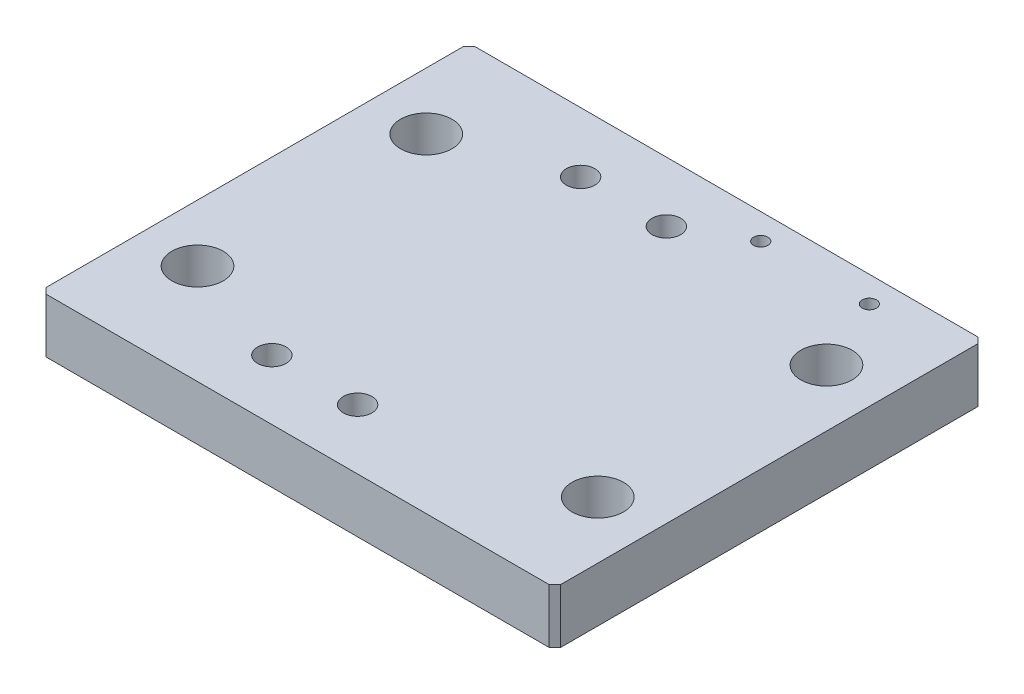
ISO-10303-21;
HEADER;
FILE_DESCRIPTION(('STEP AP214'),'2;1');
FILE_NAME('part.step','',(''),(''),'','','');
FILE_SCHEMA(('AUTOMOTIVE_DESIGN { 1 0 10303 214 1 1 1 1 }'));
ENDSEC;
DATA;
#1=APPLICATION_CONTEXT('core data for automotive mechanical design processes');
#2=APPLICATION_PROTOCOL_DEFINITION('international standard','automotive_design',2000,#1);
#3=PRODUCT_CONTEXT('',#1,'mechanical');
#4=PRODUCT('Part','Part','',(#3));
#5=PRODUCT_RELATED_PRODUCT_CATEGORY('part','',(#4));
#6=PRODUCT_DEFINITION_FORMATION('','',#4);
#7=PRODUCT_DEFINITION_CONTEXT('part definition',#1,'design');
#8=PRODUCT_DEFINITION('design','',#6,#7);
#9=PRODUCT_DEFINITION_SHAPE('','',#8);
#10=(LENGTH_UNIT() NAMED_UNIT(*) SI_UNIT(.MILLI.,.METRE.));
#11=(NAMED_UNIT(*) PLANE_ANGLE_UNIT() SI_UNIT($,.RADIAN.));
#12=(NAMED_UNIT(*) SI_UNIT($,.STERADIAN.) SOLID_ANGLE_UNIT());
#13=UNCERTAINTY_MEASURE_WITH_UNIT(LENGTH_MEASURE(1.E-05),#10,'distance_accuracy_value','');
#14=(GEOMETRIC_REPRESENTATION_CONTEXT(3) GLOBAL_UNCERTAINTY_ASSIGNED_CONTEXT((#13)) GLOBAL_UNIT_ASSIGNED_CONTEXT((#10,
#11,#12)) REPRESENTATION_CONTEXT('',''));
#15=CARTESIAN_POINT('',(0.,0.,0.));
#16=DIRECTION('',(0.,0.,1.));
#17=DIRECTION('',(1.,0.,0.));
#18=AXIS2_PLACEMENT_3D('',#15,#16,#17);
#19=CARTESIAN_POINT('',(45.,9.525,-37.5));
#20=DIRECTION('',(-1.,0.,0.));
#21=DIRECTION('',(0.,0.,1.));
#22=AXIS2_PLACEMENT_3D('',#19,#20,#21);
#23=PLANE('',#22);
#24=DIRECTION('',(0.,0.,-1.));
#25=VECTOR('',#24,1.);
#26=CARTESIAN_POINT('',(45.,9.525,-37.5));
#27=LINE('',#26,#25);
#28=CARTESIAN_POINT('',(45.,9.525,36.5));
#29=VERTEX_POINT('',#28);
#30=CARTESIAN_POINT('',(45.,9.525,-36.5));
#31=VERTEX_POINT('',#30);
#32=EDGE_CURVE('E133',#29,#31,#27,.T.);
#33=ORIENTED_EDGE('',*,*,#32,.F.);
#34=DIRECTION('',(0.,-1.,0.));
#35=VECTOR('',#34,1.);
#36=CARTESIAN_POINT('',(45.,9.525,36.5));
#37=LINE('',#36,#35);
#38=CARTESIAN_POINT('',(45.,0.,36.5));
#39=VERTEX_POINT('',#38);
#40=EDGE_CURVE('E117',#29,#39,#37,.T.);
#41=ORIENTED_EDGE('',*,*,#40,.T.);
#42=DIRECTION('',(0.,0.,-1.));
#43=VECTOR('',#42,1.);
#44=CARTESIAN_POINT('',(45.,0.,-37.5));
#45=LINE('',#44,#43);
#46=CARTESIAN_POINT('',(45.,0.,-36.5));
#47=VERTEX_POINT('',#46);
#48=EDGE_CURVE('E130',#39,#47,#45,.T.);
#49=ORIENTED_EDGE('',*,*,#48,.T.);
#50=DIRECTION('',(0.,1.,0.));
#51=VECTOR('',#50,1.);
#52=CARTESIAN_POINT('',(45.,9.525,-36.5));
#53=LINE('',#52,#51);
#54=EDGE_CURVE('E136',#47,#31,#53,.T.);
#55=ORIENTED_EDGE('',*,*,#54,.T.);
#56=EDGE_LOOP('',(#33,#41,#49,#55));
#57=FACE_BOUND('',#56,.T.);
#58=ADVANCED_FACE('F44',(#57),#23,.F.);
#59=CARTESIAN_POINT('',(-45.,9.525,-37.5));
#60=DIRECTION('',(0.,0.,1.));
#61=DIRECTION('',(1.,0.,0.));
#62=AXIS2_PLACEMENT_3D('',#59,#60,#61);
#63=PLANE('',#62);
#64=DIRECTION('',(-1.,0.,0.));
#65=VECTOR('',#64,1.);
#66=CARTESIAN_POINT('',(-45.,9.525,-37.5));
#67=LINE('',#66,#65);
#68=CARTESIAN_POINT('',(44.,9.525,-37.5));
#69=VERTEX_POINT('',#68);
#70=CARTESIAN_POINT('',(-44.,9.525,-37.5));
#71=VERTEX_POINT('',#70);
#72=EDGE_CURVE('E198',#69,#71,#67,.T.);
#73=ORIENTED_EDGE('',*,*,#72,.F.);
#74=DIRECTION('',(0.,-1.,0.));
#75=VECTOR('',#74,1.);
#76=CARTESIAN_POINT('',(44.,9.525,-37.5));
#77=LINE('',#76,#75);
#78=CARTESIAN_POINT('',(44.,0.,-37.5));
#79=VERTEX_POINT('',#78);
#80=EDGE_CURVE('E11',#69,#79,#77,.T.);
#81=ORIENTED_EDGE('',*,*,#80,.T.);
#82=DIRECTION('',(-1.,0.,0.));
#83=VECTOR('',#82,1.);
#84=CARTESIAN_POINT('',(-45.,0.,-37.5));
#85=LINE('',#84,#83);
#86=CARTESIAN_POINT('',(-44.,0.,-37.5));
#87=VERTEX_POINT('',#86);
#88=EDGE_CURVE('E142',#79,#87,#85,.T.);
#89=ORIENTED_EDGE('',*,*,#88,.T.);
#90=DIRECTION('',(0.,1.,0.));
#91=VECTOR('',#90,1.);
#92=CARTESIAN_POINT('',(-44.,9.525,-37.5));
#93=LINE('',#92,#91);
#94=EDGE_CURVE('E54',#87,#71,#93,.T.);
#95=ORIENTED_EDGE('',*,*,#94,.T.);
#96=EDGE_LOOP('',(#73,#81,#89,#95));
#97=FACE_BOUND('',#96,.T.);
#98=ADVANCED_FACE('F197',(#97),#63,.F.);
#99=CARTESIAN_POINT('',(-45.,9.525,-37.5));
#100=DIRECTION('',(1.,0.,0.));
#101=DIRECTION('',(0.,0.,-1.));
#102=AXIS2_PLACEMENT_3D('',#99,#100,#101);
#103=PLANE('',#102);
#104=DIRECTION('',(0.,0.,1.));
#105=VECTOR('',#104,1.);
#106=CARTESIAN_POINT('',(-45.,0.,-37.5));
#107=LINE('',#106,#105);
#108=CARTESIAN_POINT('',(-45.,0.,-36.5));
#109=VERTEX_POINT('',#108);
#110=CARTESIAN_POINT('',(-45.,0.,36.5));
#111=VERTEX_POINT('',#110);
#112=EDGE_CURVE('E149',#109,#111,#107,.T.);
#113=ORIENTED_EDGE('',*,*,#112,.T.);
#114=DIRECTION('',(0.,1.,0.));
#115=VECTOR('',#114,1.);
#116=CARTESIAN_POINT('',(-45.,9.525,36.5));
#117=LINE('',#116,#115);
#118=CARTESIAN_POINT('',(-45.,9.525,36.5));
#119=VERTEX_POINT('',#118);
#120=EDGE_CURVE('E61',#111,#119,#117,.T.);
#121=ORIENTED_EDGE('',*,*,#120,.T.);
#122=DIRECTION('',(0.,0.,1.));
#123=VECTOR('',#122,1.);
#124=CARTESIAN_POINT('',(-45.,9.525,-37.5));
#125=LINE('',#124,#123);
#126=CARTESIAN_POINT('',(-45.,9.525,-36.5));
#127=VERTEX_POINT('',#126);
#128=EDGE_CURVE('E205',#127,#119,#125,.T.);
#129=ORIENTED_EDGE('',*,*,#128,.F.);
#130=DIRECTION('',(0.,-1.,0.));
#131=VECTOR('',#130,1.);
#132=CARTESIAN_POINT('',(-45.,9.525,-36.5));
#133=LINE('',#132,#131);
#134=EDGE_CURVE('E187',#127,#109,#133,.T.);
#135=ORIENTED_EDGE('',*,*,#134,.T.);
#136=EDGE_LOOP('',(#113,#121,#129,#135));
#137=FACE_BOUND('',#136,.T.);
#138=ADVANCED_FACE('F209',(#137),#103,.F.);
#139=CARTESIAN_POINT('',(-45.,9.525,37.5));
#140=DIRECTION('',(0.,0.,-1.));
#141=DIRECTION('',(-1.,0.,0.));
#142=AXIS2_PLACEMENT_3D('',#139,#140,#141);
#143=PLANE('',#142);
#144=DIRECTION('',(1.,0.,0.));
#145=VECTOR('',#144,1.);
#146=CARTESIAN_POINT('',(-45.,0.,37.5));
#147=LINE('',#146,#145);
#148=CARTESIAN_POINT('',(-44.,0.,37.5));
#149=VERTEX_POINT('',#148);
#150=CARTESIAN_POINT('',(44.,0.,37.5));
#151=VERTEX_POINT('',#150);
#152=EDGE_CURVE('E160',#149,#151,#147,.T.);
#153=ORIENTED_EDGE('',*,*,#152,.T.);
#154=DIRECTION('',(0.,1.,0.));
#155=VECTOR('',#154,1.);
#156=CARTESIAN_POINT('',(44.,9.525,37.5));
#157=LINE('',#156,#155);
#158=CARTESIAN_POINT('',(44.,9.525,37.5));
#159=VERTEX_POINT('',#158);
#160=EDGE_CURVE('E118',#151,#159,#157,.T.);
#161=ORIENTED_EDGE('',*,*,#160,.T.);
#162=DIRECTION('',(1.,0.,0.));
#163=VECTOR('',#162,1.);
#164=CARTESIAN_POINT('',(-45.,9.525,37.5));
#165=LINE('',#164,#163);
#166=CARTESIAN_POINT('',(-44.,9.525,37.5));
#167=VERTEX_POINT('',#166);
#168=EDGE_CURVE('E155',#167,#159,#165,.T.);
#169=ORIENTED_EDGE('',*,*,#168,.F.);
#170=DIRECTION('',(0.,-1.,0.));
#171=VECTOR('',#170,1.);
#172=CARTESIAN_POINT('',(-44.,9.525,37.5));
#173=LINE('',#172,#171);
#174=EDGE_CURVE('E124',#167,#149,#173,.T.);
#175=ORIENTED_EDGE('',*,*,#174,.T.);
#176=EDGE_LOOP('',(#153,#161,#169,#175));
#177=FACE_BOUND('',#176,.T.);
#178=ADVANCED_FACE('F216',(#177),#143,.F.);
#179=CARTESIAN_POINT('',(0.,9.525,0.));
#180=DIRECTION('',(0.,1.,0.));
#181=DIRECTION('',(0.,0.,1.));
#182=AXIS2_PLACEMENT_3D('',#179,#180,#181);
#183=PLANE('',#182);
#184=CARTESIAN_POINT('',(10.5,9.525,-33.));
#185=DIRECTION('',(0.,1.,0.));
#186=DIRECTION('',(0.,0.,1.));
#187=AXIS2_PLACEMENT_3D('',#184,#185,#186);
#188=CIRCLE('',#187,1.25);
#189=CARTESIAN_POINT('',(10.5,9.525,-31.75));
#190=VERTEX_POINT('',#189);
#191=EDGE_CURVE('E295',#190,#190,#188,.T.);
#192=ORIENTED_EDGE('',*,*,#191,.F.);
#193=EDGE_LOOP('',(#192));
#194=FACE_BOUND('',#193,.T.);
#195=CARTESIAN_POINT('',(29.5,9.525,-33.));
#196=DIRECTION('',(0.,1.,0.));
#197=DIRECTION('',(0.,0.,1.));
#198=AXIS2_PLACEMENT_3D('',#195,#196,#197);
#199=CIRCLE('',#198,1.25);
#200=CARTESIAN_POINT('',(29.5,9.525,-31.75));
#201=VERTEX_POINT('',#200);
#202=EDGE_CURVE('E287',#201,#201,#199,.T.);
#203=ORIENTED_EDGE('',*,*,#202,.F.);
#204=EDGE_LOOP('',(#203));
#205=FACE_BOUND('',#204,.T.);
#206=CARTESIAN_POINT('',(-15.,9.525,-27.));
#207=DIRECTION('',(0.,1.,0.));
#208=DIRECTION('',(0.,0.,1.));
#209=AXIS2_PLACEMENT_3D('',#206,#207,#208);
#210=CIRCLE('',#209,2.5);
#211=CARTESIAN_POINT('',(-15.,9.525,-24.5));
#212=VERTEX_POINT('',#211);
#213=EDGE_CURVE('E279',#212,#212,#210,.T.);
#214=ORIENTED_EDGE('',*,*,#213,.F.);
#215=EDGE_LOOP('',(#214));
#216=FACE_BOUND('',#215,.T.);
#217=CARTESIAN_POINT('',(0.,9.525,-27.));
#218=DIRECTION('',(0.,1.,0.));
#219=DIRECTION('',(0.,0.,1.));
#220=AXIS2_PLACEMENT_3D('',#217,#218,#219);
#221=CIRCLE('',#220,2.5);
#222=CARTESIAN_POINT('',(0.,9.525,-24.5));
#223=VERTEX_POINT('',#222);
#224=EDGE_CURVE('E271',#223,#223,#221,.T.);
#225=ORIENTED_EDGE('',*,*,#224,.F.);
#226=EDGE_LOOP('',(#225));
#227=FACE_BOUND('',#226,.T.);
#228=CARTESIAN_POINT('',(0.,9.525,27.));
#229=DIRECTION('',(0.,1.,0.));
#230=DIRECTION('',(0.,0.,1.));
#231=AXIS2_PLACEMENT_3D('',#228,#229,#230);
#232=CIRCLE('',#231,2.5);
#233=CARTESIAN_POINT('',(0.,9.525,29.5));
#234=VERTEX_POINT('',#233);
#235=EDGE_CURVE('E263',#234,#234,#232,.T.);
#236=ORIENTED_EDGE('',*,*,#235,.F.);
#237=EDGE_LOOP('',(#236));
#238=FACE_BOUND('',#237,.T.);
#239=CARTESIAN_POINT('',(-15.,9.525,27.));
#240=DIRECTION('',(0.,1.,0.));
#241=DIRECTION('',(0.,0.,1.));
#242=AXIS2_PLACEMENT_3D('',#239,#240,#241);
#243=CIRCLE('',#242,2.5);
#244=CARTESIAN_POINT('',(-15.,9.525,29.5));
#245=VERTEX_POINT('',#244);
#246=EDGE_CURVE('E255',#245,#245,#243,.T.);
#247=ORIENTED_EDGE('',*,*,#246,.F.);
#248=EDGE_LOOP('',(#247));
#249=FACE_BOUND('',#248,.T.);
#250=CARTESIAN_POINT('',(-35.,9.525,-20.));
#251=DIRECTION('',(0.,1.,0.));
#252=DIRECTION('',(0.,0.,1.));
#253=AXIS2_PLACEMENT_3D('',#250,#251,#252);
#254=CIRCLE('',#253,4.5);
#255=CARTESIAN_POINT('',(-35.,9.525,-15.5));
#256=VERTEX_POINT('',#255);
#257=EDGE_CURVE('E247',#256,#256,#254,.T.);
#258=ORIENTED_EDGE('',*,*,#257,.F.);
#259=EDGE_LOOP('',(#258));
#260=FACE_BOUND('',#259,.T.);
#261=CARTESIAN_POINT('',(35.,9.525,-20.));
#262=DIRECTION('',(0.,1.,0.));
#263=DIRECTION('',(0.,0.,1.));
#264=AXIS2_PLACEMENT_3D('',#261,#262,#263);
#265=CIRCLE('',#264,4.5);
#266=CARTESIAN_POINT('',(35.,9.525,-15.5));
#267=VERTEX_POINT('',#266);
#268=EDGE_CURVE('E239',#267,#267,#265,.T.);
#269=ORIENTED_EDGE('',*,*,#268,.F.);
#270=EDGE_LOOP('',(#269));
#271=FACE_BOUND('',#270,.T.);
#272=CARTESIAN_POINT('',(35.,9.525,20.));
#273=DIRECTION('',(0.,1.,0.));
#274=DIRECTION('',(0.,0.,1.));
#275=AXIS2_PLACEMENT_3D('',#272,#273,#274);
#276=CIRCLE('',#275,4.5);
#277=CARTESIAN_POINT('',(35.,9.525,24.5));
#278=VERTEX_POINT('',#277);
#279=EDGE_CURVE('E231',#278,#278,#276,.T.);
#280=ORIENTED_EDGE('',*,*,#279,.F.);
#281=EDGE_LOOP('',(#280));
#282=FACE_BOUND('',#281,.T.);
#283=CARTESIAN_POINT('',(-35.,9.525,20.));
#284=DIRECTION('',(0.,1.,0.));
#285=DIRECTION('',(0.,0.,1.));
#286=AXIS2_PLACEMENT_3D('',#283,#284,#285);
#287=CIRCLE('',#286,4.5);
#288=CARTESIAN_POINT('',(-35.,9.525,24.5));
#289=VERTEX_POINT('',#288);
#290=EDGE_CURVE('E152',#289,#289,#287,.T.);
#291=ORIENTED_EDGE('',*,*,#290,.F.);
#292=EDGE_LOOP('',(#291));
#293=FACE_BOUND('',#292,.T.);
#294=ORIENTED_EDGE('',*,*,#168,.T.);
#295=DIRECTION('',(-0.707106781186555,0.,0.70710678118654));
#296=VECTOR('',#295,1.);
#297=CARTESIAN_POINT('',(40.7499999999995,9.525,40.7500000000004));
#298=LINE('',#297,#296);
#299=EDGE_CURVE('E184',#159,#29,#298,.F.);
#300=ORIENTED_EDGE('',*,*,#299,.T.);
#301=ORIENTED_EDGE('',*,*,#32,.T.);
#302=DIRECTION('',(0.707106781186548,0.,0.707106781186548));
#303=VECTOR('',#302,1.);
#304=CARTESIAN_POINT('',(40.75,9.525,-40.75));
#305=LINE('',#304,#303);
#306=EDGE_CURVE('E178',#31,#69,#305,.F.);
#307=ORIENTED_EDGE('',*,*,#306,.T.);
#308=ORIENTED_EDGE('',*,*,#72,.T.);
#309=DIRECTION('',(0.707106781186552,0.,-0.707106781186543));
#310=VECTOR('',#309,1.);
#311=CARTESIAN_POINT('',(-40.7499999999997,9.525,-40.7500000000003));
#312=LINE('',#311,#310);
#313=EDGE_CURVE('E68',#71,#127,#312,.F.);
#314=ORIENTED_EDGE('',*,*,#313,.T.);
#315=ORIENTED_EDGE('',*,*,#128,.T.);
#316=DIRECTION('',(-0.707106781186545,0.,-0.70710678118655));
#317=VECTOR('',#316,1.);
#318=CARTESIAN_POINT('',(-40.7500000000002,9.525,40.7499999999999));
#319=LINE('',#318,#317);
#320=EDGE_CURVE('E181',#119,#167,#319,.F.);
#321=ORIENTED_EDGE('',*,*,#320,.T.);
#322=EDGE_LOOP('',(#294,#300,#301,#307,#308,#314,#315,#321));
#323=FACE_BOUND('',#322,.T.);
#324=ADVANCED_FACE('F202',(#194,#205,#216,#227,#238,#249,#260,#271,#282,#293,#323),#183,.T.);
#325=CARTESIAN_POINT('',(0.,0.,0.));
#326=DIRECTION('',(0.,1.,0.));
#327=DIRECTION('',(0.,0.,1.));
#328=AXIS2_PLACEMENT_3D('',#325,#326,#327);
#329=PLANE('',#328);
#330=CARTESIAN_POINT('',(10.5,0.,-33.));
#331=DIRECTION('',(0.,1.,0.));
#332=DIRECTION('',(0.,0.,1.));
#333=AXIS2_PLACEMENT_3D('',#330,#331,#332);
#334=CIRCLE('',#333,1.25);
#335=CARTESIAN_POINT('',(10.5,0.,-31.75));
#336=VERTEX_POINT('',#335);
#337=EDGE_CURVE('E291',#336,#336,#334,.T.);
#338=ORIENTED_EDGE('',*,*,#337,.T.);
#339=EDGE_LOOP('',(#338));
#340=FACE_BOUND('',#339,.T.);
#341=CARTESIAN_POINT('',(29.5,0.,-33.));
#342=DIRECTION('',(0.,1.,0.));
#343=DIRECTION('',(0.,0.,1.));
#344=AXIS2_PLACEMENT_3D('',#341,#342,#343);
#345=CIRCLE('',#344,1.25);
#346=CARTESIAN_POINT('',(29.5,0.,-31.75));
#347=VERTEX_POINT('',#346);
#348=EDGE_CURVE('E283',#347,#347,#345,.T.);
#349=ORIENTED_EDGE('',*,*,#348,.T.);
#350=EDGE_LOOP('',(#349));
#351=FACE_BOUND('',#350,.T.);
#352=CARTESIAN_POINT('',(-15.,0.,-27.));
#353=DIRECTION('',(0.,1.,0.));
#354=DIRECTION('',(0.,0.,1.));
#355=AXIS2_PLACEMENT_3D('',#352,#353,#354);
#356=CIRCLE('',#355,2.5);
#357=CARTESIAN_POINT('',(-15.,0.,-24.5));
#358=VERTEX_POINT('',#357);
#359=EDGE_CURVE('E275',#358,#358,#356,.T.);
#360=ORIENTED_EDGE('',*,*,#359,.T.);
#361=EDGE_LOOP('',(#360));
#362=FACE_BOUND('',#361,.T.);
#363=CARTESIAN_POINT('',(0.,0.,-27.));
#364=DIRECTION('',(0.,1.,0.));
#365=DIRECTION('',(0.,0.,1.));
#366=AXIS2_PLACEMENT_3D('',#363,#364,#365);
#367=CIRCLE('',#366,2.5);
#368=CARTESIAN_POINT('',(0.,0.,-24.5));
#369=VERTEX_POINT('',#368);
#370=EDGE_CURVE('E267',#369,#369,#367,.T.);
#371=ORIENTED_EDGE('',*,*,#370,.T.);
#372=EDGE_LOOP('',(#371));
#373=FACE_BOUND('',#372,.T.);
#374=CARTESIAN_POINT('',(0.,0.,27.));
#375=DIRECTION('',(0.,1.,0.));
#376=DIRECTION('',(0.,0.,1.));
#377=AXIS2_PLACEMENT_3D('',#374,#375,#376);
#378=CIRCLE('',#377,2.5);
#379=CARTESIAN_POINT('',(0.,0.,29.5));
#380=VERTEX_POINT('',#379);
#381=EDGE_CURVE('E259',#380,#380,#378,.T.);
#382=ORIENTED_EDGE('',*,*,#381,.T.);
#383=EDGE_LOOP('',(#382));
#384=FACE_BOUND('',#383,.T.);
#385=CARTESIAN_POINT('',(-15.,0.,27.));
#386=DIRECTION('',(0.,1.,0.));
#387=DIRECTION('',(0.,0.,1.));
#388=AXIS2_PLACEMENT_3D('',#385,#386,#387);
#389=CIRCLE('',#388,2.5);
#390=CARTESIAN_POINT('',(-15.,0.,29.5));
#391=VERTEX_POINT('',#390);
#392=EDGE_CURVE('E251',#391,#391,#389,.T.);
#393=ORIENTED_EDGE('',*,*,#392,.T.);
#394=EDGE_LOOP('',(#393));
#395=FACE_BOUND('',#394,.T.);
#396=CARTESIAN_POINT('',(-35.,0.,-20.));
#397=DIRECTION('',(0.,1.,0.));
#398=DIRECTION('',(0.,0.,1.));
#399=AXIS2_PLACEMENT_3D('',#396,#397,#398);
#400=CIRCLE('',#399,4.5);
#401=CARTESIAN_POINT('',(-35.,0.,-15.5));
#402=VERTEX_POINT('',#401);
#403=EDGE_CURVE('E243',#402,#402,#400,.T.);
#404=ORIENTED_EDGE('',*,*,#403,.T.);
#405=EDGE_LOOP('',(#404));
#406=FACE_BOUND('',#405,.T.);
#407=CARTESIAN_POINT('',(35.,0.,-20.));
#408=DIRECTION('',(0.,1.,0.));
#409=DIRECTION('',(0.,0.,1.));
#410=AXIS2_PLACEMENT_3D('',#407,#408,#409);
#411=CIRCLE('',#410,4.5);
#412=CARTESIAN_POINT('',(35.,0.,-15.5));
#413=VERTEX_POINT('',#412);
#414=EDGE_CURVE('E235',#413,#413,#411,.T.);
#415=ORIENTED_EDGE('',*,*,#414,.T.);
#416=EDGE_LOOP('',(#415));
#417=FACE_BOUND('',#416,.T.);
#418=CARTESIAN_POINT('',(35.,0.,20.));
#419=DIRECTION('',(0.,1.,0.));
#420=DIRECTION('',(0.,0.,1.));
#421=AXIS2_PLACEMENT_3D('',#418,#419,#420);
#422=CIRCLE('',#421,4.5);
#423=CARTESIAN_POINT('',(35.,0.,24.5));
#424=VERTEX_POINT('',#423);
#425=EDGE_CURVE('E227',#424,#424,#422,.T.);
#426=ORIENTED_EDGE('',*,*,#425,.T.);
#427=EDGE_LOOP('',(#426));
#428=FACE_BOUND('',#427,.T.);
#429=CARTESIAN_POINT('',(-35.,0.,20.));
#430=DIRECTION('',(0.,1.,0.));
#431=DIRECTION('',(0.,0.,1.));
#432=AXIS2_PLACEMENT_3D('',#429,#430,#431);
#433=CIRCLE('',#432,4.5);
#434=CARTESIAN_POINT('',(-35.,0.,24.5));
#435=VERTEX_POINT('',#434);
#436=EDGE_CURVE('E143',#435,#435,#433,.T.);
#437=ORIENTED_EDGE('',*,*,#436,.T.);
#438=EDGE_LOOP('',(#437));
#439=FACE_BOUND('',#438,.T.);
#440=ORIENTED_EDGE('',*,*,#48,.F.);
#441=DIRECTION('',(0.707106781186555,0.,-0.70710678118654));
#442=VECTOR('',#441,1.);
#443=CARTESIAN_POINT('',(45.,0.,36.5));
#444=LINE('',#443,#442);
#445=EDGE_CURVE('E113',#39,#151,#444,.F.);
#446=ORIENTED_EDGE('',*,*,#445,.T.);
#447=ORIENTED_EDGE('',*,*,#152,.F.);
#448=DIRECTION('',(0.707106781186545,0.,0.70710678118655));
#449=VECTOR('',#448,1.);
#450=CARTESIAN_POINT('',(-44.,0.,37.5));
#451=LINE('',#450,#449);
#452=EDGE_CURVE('E125',#149,#111,#451,.F.);
#453=ORIENTED_EDGE('',*,*,#452,.T.);
#454=ORIENTED_EDGE('',*,*,#112,.F.);
#455=DIRECTION('',(-0.707106781186552,0.,0.707106781186543));
#456=VECTOR('',#455,1.);
#457=CARTESIAN_POINT('',(-45.,0.,-36.5));
#458=LINE('',#457,#456);
#459=EDGE_CURVE('E135',#109,#87,#458,.F.);
#460=ORIENTED_EDGE('',*,*,#459,.T.);
#461=ORIENTED_EDGE('',*,*,#88,.F.);
#462=DIRECTION('',(-0.707106781186548,0.,-0.707106781186548));
#463=VECTOR('',#462,1.);
#464=CARTESIAN_POINT('',(44.,0.,-37.5));
#465=LINE('',#464,#463);
#466=EDGE_CURVE('E140',#79,#47,#465,.F.);
#467=ORIENTED_EDGE('',*,*,#466,.T.);
#468=EDGE_LOOP('',(#440,#446,#447,#453,#454,#460,#461,#467));
#469=FACE_BOUND('',#468,.T.);
#470=ADVANCED_FACE('F138',(#340,#351,#362,#373,#384,#395,#406,#417,#428,#439,#469),#329,.F.);
#471=CARTESIAN_POINT('',(-35.,9.525,20.));
#472=DIRECTION('',(0.,1.,0.));
#473=DIRECTION('',(0.,0.,1.));
#474=AXIS2_PLACEMENT_3D('',#471,#472,#473);
#475=CYLINDRICAL_SURFACE('',#474,4.5);
#476=ORIENTED_EDGE('',*,*,#436,.F.);
#477=EDGE_LOOP('',(#476));
#478=FACE_BOUND('',#477,.T.);
#479=ORIENTED_EDGE('',*,*,#290,.T.);
#480=EDGE_LOOP('',(#479));
#481=FACE_BOUND('',#480,.T.);
#482=ADVANCED_FACE('F324',(#478,#481),#475,.F.);
#483=CARTESIAN_POINT('',(35.,9.525,20.));
#484=DIRECTION('',(0.,1.,0.));
#485=DIRECTION('',(0.,0.,1.));
#486=AXIS2_PLACEMENT_3D('',#483,#484,#485);
#487=CYLINDRICAL_SURFACE('',#486,4.5);
#488=ORIENTED_EDGE('',*,*,#425,.F.);
#489=EDGE_LOOP('',(#488));
#490=FACE_BOUND('',#489,.T.);
#491=ORIENTED_EDGE('',*,*,#279,.T.);
#492=EDGE_LOOP('',(#491));
#493=FACE_BOUND('',#492,.T.);
#494=ADVANCED_FACE('F326',(#490,#493),#487,.F.);
#495=CARTESIAN_POINT('',(35.,9.525,-20.));
#496=DIRECTION('',(0.,1.,0.));
#497=DIRECTION('',(0.,0.,1.));
#498=AXIS2_PLACEMENT_3D('',#495,#496,#497);
#499=CYLINDRICAL_SURFACE('',#498,4.5);
#500=ORIENTED_EDGE('',*,*,#414,.F.);
#501=EDGE_LOOP('',(#500));
#502=FACE_BOUND('',#501,.T.);
#503=ORIENTED_EDGE('',*,*,#268,.T.);
#504=EDGE_LOOP('',(#503));
#505=FACE_BOUND('',#504,.T.);
#506=ADVANCED_FACE('F333',(#502,#505),#499,.F.);
#507=CARTESIAN_POINT('',(-35.,9.525,-20.));
#508=DIRECTION('',(0.,1.,0.));
#509=DIRECTION('',(0.,0.,1.));
#510=AXIS2_PLACEMENT_3D('',#507,#508,#509);
#511=CYLINDRICAL_SURFACE('',#510,4.5);
#512=ORIENTED_EDGE('',*,*,#403,.F.);
#513=EDGE_LOOP('',(#512));
#514=FACE_BOUND('',#513,.T.);
#515=ORIENTED_EDGE('',*,*,#257,.T.);
#516=EDGE_LOOP('',(#515));
#517=FACE_BOUND('',#516,.T.);
#518=ADVANCED_FACE('F444',(#514,#517),#511,.F.);
#519=CARTESIAN_POINT('',(-15.,9.525,27.));
#520=DIRECTION('',(0.,1.,0.));
#521=DIRECTION('',(0.,0.,1.));
#522=AXIS2_PLACEMENT_3D('',#519,#520,#521);
#523=CYLINDRICAL_SURFACE('',#522,2.5);
#524=ORIENTED_EDGE('',*,*,#392,.F.);
#525=EDGE_LOOP('',(#524));
#526=FACE_BOUND('',#525,.T.);
#527=ORIENTED_EDGE('',*,*,#246,.T.);
#528=EDGE_LOOP('',(#527));
#529=FACE_BOUND('',#528,.T.);
#530=ADVANCED_FACE('F434',(#526,#529),#523,.F.);
#531=CARTESIAN_POINT('',(0.,9.525,27.));
#532=DIRECTION('',(0.,1.,0.));
#533=DIRECTION('',(0.,0.,1.));
#534=AXIS2_PLACEMENT_3D('',#531,#532,#533);
#535=CYLINDRICAL_SURFACE('',#534,2.5);
#536=ORIENTED_EDGE('',*,*,#381,.F.);
#537=EDGE_LOOP('',(#536));
#538=FACE_BOUND('',#537,.T.);
#539=ORIENTED_EDGE('',*,*,#235,.T.);
#540=EDGE_LOOP('',(#539));
#541=FACE_BOUND('',#540,.T.);
#542=ADVANCED_FACE('F424',(#538,#541),#535,.F.);
#543=CARTESIAN_POINT('',(0.,9.525,-27.));
#544=DIRECTION('',(0.,1.,0.));
#545=DIRECTION('',(0.,0.,1.));
#546=AXIS2_PLACEMENT_3D('',#543,#544,#545);
#547=CYLINDRICAL_SURFACE('',#546,2.5);
#548=ORIENTED_EDGE('',*,*,#370,.F.);
#549=EDGE_LOOP('',(#548));
#550=FACE_BOUND('',#549,.T.);
#551=ORIENTED_EDGE('',*,*,#224,.T.);
#552=EDGE_LOOP('',(#551));
#553=FACE_BOUND('',#552,.T.);
#554=ADVANCED_FACE('F414',(#550,#553),#547,.F.);
#555=CARTESIAN_POINT('',(-15.,9.525,-27.));
#556=DIRECTION('',(0.,1.,0.));
#557=DIRECTION('',(0.,0.,1.));
#558=AXIS2_PLACEMENT_3D('',#555,#556,#557);
#559=CYLINDRICAL_SURFACE('',#558,2.5);
#560=ORIENTED_EDGE('',*,*,#359,.F.);
#561=EDGE_LOOP('',(#560));
#562=FACE_BOUND('',#561,.T.);
#563=ORIENTED_EDGE('',*,*,#213,.T.);
#564=EDGE_LOOP('',(#563));
#565=FACE_BOUND('',#564,.T.);
#566=ADVANCED_FACE('F403',(#562,#565),#559,.F.);
#567=CARTESIAN_POINT('',(29.5,9.525,-33.));
#568=DIRECTION('',(0.,1.,0.));
#569=DIRECTION('',(0.,0.,1.));
#570=AXIS2_PLACEMENT_3D('',#567,#568,#569);
#571=CYLINDRICAL_SURFACE('',#570,1.25);
#572=ORIENTED_EDGE('',*,*,#348,.F.);
#573=EDGE_LOOP('',(#572));
#574=FACE_BOUND('',#573,.T.);
#575=ORIENTED_EDGE('',*,*,#202,.T.);
#576=EDGE_LOOP('',(#575));
#577=FACE_BOUND('',#576,.T.);
#578=ADVANCED_FACE('F393',(#574,#577),#571,.F.);
#579=CARTESIAN_POINT('',(10.5,9.525,-33.));
#580=DIRECTION('',(0.,1.,0.));
#581=DIRECTION('',(0.,0.,1.));
#582=AXIS2_PLACEMENT_3D('',#579,#580,#581);
#583=CYLINDRICAL_SURFACE('',#582,1.25);
#584=ORIENTED_EDGE('',*,*,#337,.F.);
#585=EDGE_LOOP('',(#584));
#586=FACE_BOUND('',#585,.T.);
#587=ORIENTED_EDGE('',*,*,#191,.T.);
#588=EDGE_LOOP('',(#587));
#589=FACE_BOUND('',#588,.T.);
#590=ADVANCED_FACE('F301',(#586,#589),#583,.F.);
#591=CARTESIAN_POINT('',(45.,9.525,36.5));
#592=DIRECTION('',(-0.70710678118654,0.,-0.707106781186555));
#593=DIRECTION('',(0.,-1.,0.));
#594=AXIS2_PLACEMENT_3D('',#591,#592,#593);
#595=PLANE('',#594);
#596=ORIENTED_EDGE('',*,*,#299,.F.);
#597=ORIENTED_EDGE('',*,*,#160,.F.);
#598=ORIENTED_EDGE('',*,*,#445,.F.);
#599=ORIENTED_EDGE('',*,*,#40,.F.);
#600=EDGE_LOOP('',(#596,#597,#598,#599));
#601=FACE_BOUND('',#600,.T.);
#602=ADVANCED_FACE('F116',(#601),#595,.F.);
#603=CARTESIAN_POINT('',(-44.,9.525,37.5));
#604=DIRECTION('',(0.70710678118655,0.,-0.707106781186545));
#605=DIRECTION('',(0.,-1.,0.));
#606=AXIS2_PLACEMENT_3D('',#603,#604,#605);
#607=PLANE('',#606);
#608=ORIENTED_EDGE('',*,*,#320,.F.);
#609=ORIENTED_EDGE('',*,*,#120,.F.);
#610=ORIENTED_EDGE('',*,*,#452,.F.);
#611=ORIENTED_EDGE('',*,*,#174,.F.);
#612=EDGE_LOOP('',(#608,#609,#610,#611));
#613=FACE_BOUND('',#612,.T.);
#614=ADVANCED_FACE('F213',(#613),#607,.F.);
#615=CARTESIAN_POINT('',(44.,9.525,-37.5));
#616=DIRECTION('',(-0.707106781186547,0.,0.707106781186547));
#617=DIRECTION('',(0.,-1.,0.));
#618=AXIS2_PLACEMENT_3D('',#615,#616,#617);
#619=PLANE('',#618);
#620=ORIENTED_EDGE('',*,*,#306,.F.);
#621=ORIENTED_EDGE('',*,*,#54,.F.);
#622=ORIENTED_EDGE('',*,*,#466,.F.);
#623=ORIENTED_EDGE('',*,*,#80,.F.);
#624=EDGE_LOOP('',(#620,#621,#622,#623));
#625=FACE_BOUND('',#624,.T.);
#626=ADVANCED_FACE('F357',(#625),#619,.F.);
#627=CARTESIAN_POINT('',(-45.,9.525,-36.5));
#628=DIRECTION('',(0.707106781186542,0.,0.707106781186552));
#629=DIRECTION('',(0.,-1.,0.));
#630=AXIS2_PLACEMENT_3D('',#627,#628,#629);
#631=PLANE('',#630);
#632=ORIENTED_EDGE('',*,*,#313,.F.);
#633=ORIENTED_EDGE('',*,*,#94,.F.);
#634=ORIENTED_EDGE('',*,*,#459,.F.);
#635=ORIENTED_EDGE('',*,*,#134,.F.);
#636=EDGE_LOOP('',(#632,#633,#634,#635));
#637=FACE_BOUND('',#636,.T.);
#638=ADVANCED_FACE('F47',(#637),#631,.F.);
#639=CLOSED_SHELL('',(#58,#98,#138,#178,#324,#470,#482,#494,#506,#518,#530,#542,#554,#566,#578,
#590,#602,#614,#626,#638));
#640=MANIFOLD_SOLID_BREP('B2',#639);
#641=ADVANCED_BREP_SHAPE_REPRESENTATION('',(#18,#640),#14);
#642=SHAPE_DEFINITION_REPRESENTATION(#9,#641);
ENDSEC;
END-ISO-10303-21;
